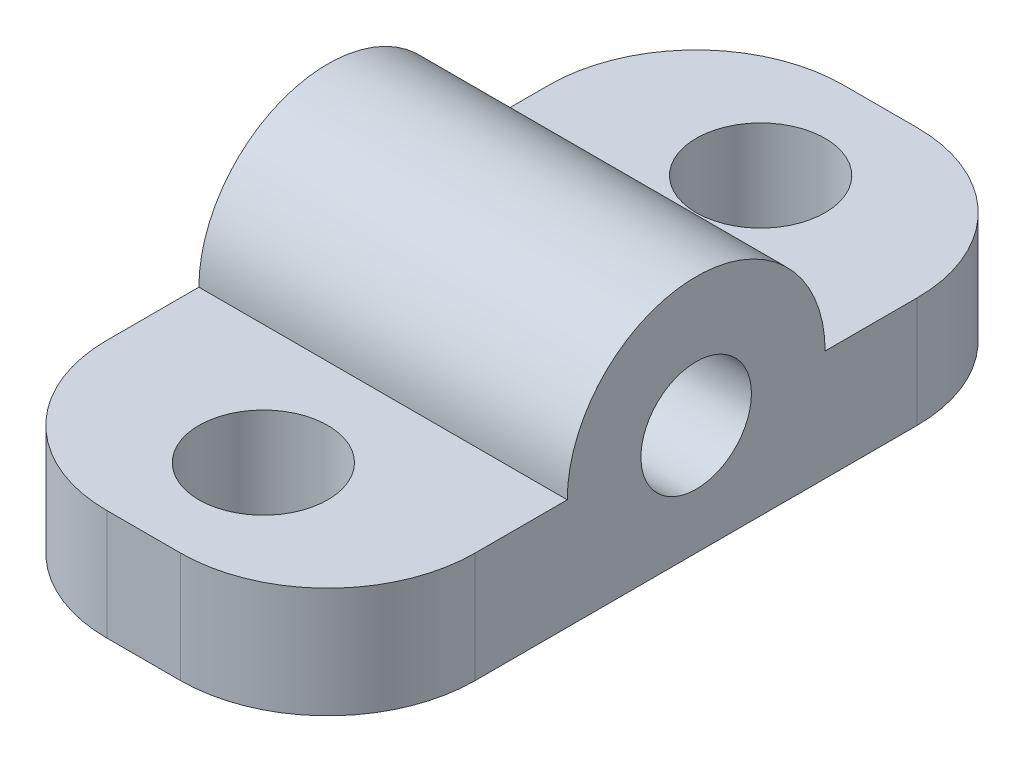
ISO-10303-21;
HEADER;
FILE_DESCRIPTION(('STEP AP214'),'2;1');
FILE_NAME('part.step','',(''),(''),'','','');
FILE_SCHEMA(('AUTOMOTIVE_DESIGN { 1 0 10303 214 1 1 1 1 }'));
ENDSEC;
DATA;
#1=APPLICATION_CONTEXT('core data for automotive mechanical design processes');
#2=APPLICATION_PROTOCOL_DEFINITION('international standard','automotive_design',2000,#1);
#3=PRODUCT_CONTEXT('',#1,'mechanical');
#4=PRODUCT('Part','Part','',(#3));
#5=PRODUCT_RELATED_PRODUCT_CATEGORY('part','',(#4));
#6=PRODUCT_DEFINITION_FORMATION('','',#4);
#7=PRODUCT_DEFINITION_CONTEXT('part definition',#1,'design');
#8=PRODUCT_DEFINITION('design','',#6,#7);
#9=PRODUCT_DEFINITION_SHAPE('','',#8);
#10=(LENGTH_UNIT() NAMED_UNIT(*) SI_UNIT(.MILLI.,.METRE.));
#11=(NAMED_UNIT(*) PLANE_ANGLE_UNIT() SI_UNIT($,.RADIAN.));
#12=(NAMED_UNIT(*) SI_UNIT($,.STERADIAN.) SOLID_ANGLE_UNIT());
#13=UNCERTAINTY_MEASURE_WITH_UNIT(LENGTH_MEASURE(1.E-05),#10,'distance_accuracy_value','');
#14=(GEOMETRIC_REPRESENTATION_CONTEXT(3) GLOBAL_UNCERTAINTY_ASSIGNED_CONTEXT((#13)) GLOBAL_UNIT_ASSIGNED_CONTEXT((#10,
#11,#12)) REPRESENTATION_CONTEXT('',''));
#15=CARTESIAN_POINT('',(0.,0.,0.));
#16=DIRECTION('',(0.,0.,1.));
#17=DIRECTION('',(1.,0.,0.));
#18=AXIS2_PLACEMENT_3D('',#15,#16,#17);
#19=CARTESIAN_POINT('',(10.,0.,0.));
#20=DIRECTION('',(1.,0.,0.));
#21=DIRECTION('',(0.,0.,-1.));
#22=AXIS2_PLACEMENT_3D('',#19,#20,#21);
#23=PLANE('',#22);
#24=DIRECTION('',(0.,0.,1.));
#25=VECTOR('',#24,1.);
#26=CARTESIAN_POINT('',(10.,0.,10.));
#27=LINE('',#26,#25);
#28=CARTESIAN_POINT('',(10.,0.,3.5));
#29=VERTEX_POINT('',#28);
#30=CARTESIAN_POINT('',(10.,0.,6.));
#31=VERTEX_POINT('',#30);
#32=EDGE_CURVE('E135',#29,#31,#27,.T.);
#33=ORIENTED_EDGE('',*,*,#32,.T.);
#34=DIRECTION('',(0.,-1.,0.));
#35=VECTOR('',#34,1.);
#36=CARTESIAN_POINT('',(10.,-3.,6.));
#37=LINE('',#36,#35);
#38=CARTESIAN_POINT('',(10.,-3.,6.));
#39=VERTEX_POINT('',#38);
#40=EDGE_CURVE('E183',#31,#39,#37,.T.);
#41=ORIENTED_EDGE('',*,*,#40,.T.);
#42=DIRECTION('',(0.,0.,-1.));
#43=VECTOR('',#42,1.);
#44=CARTESIAN_POINT('',(10.,-3.,10.));
#45=LINE('',#44,#43);
#46=CARTESIAN_POINT('',(10.,-3.,-6.));
#47=VERTEX_POINT('',#46);
#48=EDGE_CURVE('E120',#39,#47,#45,.T.);
#49=ORIENTED_EDGE('',*,*,#48,.T.);
#50=DIRECTION('',(0.,1.,0.));
#51=VECTOR('',#50,1.);
#52=CARTESIAN_POINT('',(10.,0.,-6.));
#53=LINE('',#52,#51);
#54=CARTESIAN_POINT('',(10.,0.,-6.));
#55=VERTEX_POINT('',#54);
#56=EDGE_CURVE('E119',#47,#55,#53,.T.);
#57=ORIENTED_EDGE('',*,*,#56,.T.);
#58=DIRECTION('',(0.,0.,1.));
#59=VECTOR('',#58,1.);
#60=CARTESIAN_POINT('',(10.,0.,-3.5));
#61=LINE('',#60,#59);
#62=CARTESIAN_POINT('',(10.,0.,-3.5));
#63=VERTEX_POINT('',#62);
#64=EDGE_CURVE('E110',#55,#63,#61,.T.);
#65=ORIENTED_EDGE('',*,*,#64,.T.);
#66=CARTESIAN_POINT('',(10.,0.,0.));
#67=DIRECTION('',(1.,0.,0.));
#68=DIRECTION('',(0.,0.,-1.));
#69=AXIS2_PLACEMENT_3D('',#66,#67,#68);
#70=CIRCLE('',#69,3.5);
#71=EDGE_CURVE('E115',#63,#29,#70,.T.);
#72=ORIENTED_EDGE('',*,*,#71,.T.);
#73=EDGE_LOOP('',(#33,#41,#49,#57,#65,#72));
#74=FACE_BOUND('',#73,.T.);
#75=CARTESIAN_POINT('',(10.,0.,0.));
#76=DIRECTION('',(1.,0.,0.));
#77=DIRECTION('',(0.,0.,-1.));
#78=AXIS2_PLACEMENT_3D('',#75,#76,#77);
#79=CIRCLE('',#78,1.5);
#80=CARTESIAN_POINT('',(10.,0.,-1.5));
#81=VERTEX_POINT('',#80);
#82=EDGE_CURVE('E144',#81,#81,#79,.T.);
#83=ORIENTED_EDGE('',*,*,#82,.F.);
#84=EDGE_LOOP('',(#83));
#85=FACE_BOUND('',#84,.T.);
#86=ADVANCED_FACE('F35',(#74,#85),#23,.T.);
#87=CARTESIAN_POINT('',(0.,0.,0.));
#88=DIRECTION('',(1.,0.,0.));
#89=DIRECTION('',(0.,0.,-1.));
#90=AXIS2_PLACEMENT_3D('',#87,#88,#89);
#91=PLANE('',#90);
#92=DIRECTION('',(0.,0.,-1.));
#93=VECTOR('',#92,1.);
#94=CARTESIAN_POINT('',(0.,-3.,10.));
#95=LINE('',#94,#93);
#96=CARTESIAN_POINT('',(0.,-3.,6.));
#97=VERTEX_POINT('',#96);
#98=CARTESIAN_POINT('',(0.,-3.,-6.));
#99=VERTEX_POINT('',#98);
#100=EDGE_CURVE('E141',#97,#99,#95,.T.);
#101=ORIENTED_EDGE('',*,*,#100,.F.);
#102=DIRECTION('',(0.,-1.,0.));
#103=VECTOR('',#102,1.);
#104=CARTESIAN_POINT('',(0.,0.,6.));
#105=LINE('',#104,#103);
#106=CARTESIAN_POINT('',(0.,0.,6.));
#107=VERTEX_POINT('',#106);
#108=EDGE_CURVE('E176',#97,#107,#105,.F.);
#109=ORIENTED_EDGE('',*,*,#108,.T.);
#110=DIRECTION('',(0.,0.,1.));
#111=VECTOR('',#110,1.);
#112=CARTESIAN_POINT('',(0.,0.,10.));
#113=LINE('',#112,#111);
#114=CARTESIAN_POINT('',(0.,0.,3.5));
#115=VERTEX_POINT('',#114);
#116=EDGE_CURVE('E148',#115,#107,#113,.T.);
#117=ORIENTED_EDGE('',*,*,#116,.F.);
#118=CARTESIAN_POINT('',(0.,0.,0.));
#119=DIRECTION('',(1.,0.,0.));
#120=DIRECTION('',(0.,0.,-1.));
#121=AXIS2_PLACEMENT_3D('',#118,#119,#120);
#122=CIRCLE('',#121,3.5);
#123=CARTESIAN_POINT('',(0.,0.,-3.5));
#124=VERTEX_POINT('',#123);
#125=EDGE_CURVE('E146',#124,#115,#122,.T.);
#126=ORIENTED_EDGE('',*,*,#125,.F.);
#127=DIRECTION('',(0.,0.,1.));
#128=VECTOR('',#127,1.);
#129=CARTESIAN_POINT('',(0.,0.,-3.5));
#130=LINE('',#129,#128);
#131=CARTESIAN_POINT('',(0.,0.,-6.));
#132=VERTEX_POINT('',#131);
#133=EDGE_CURVE('E126',#132,#124,#130,.T.);
#134=ORIENTED_EDGE('',*,*,#133,.F.);
#135=DIRECTION('',(0.,1.,0.));
#136=VECTOR('',#135,1.);
#137=CARTESIAN_POINT('',(0.,0.,-6.));
#138=LINE('',#137,#136);
#139=EDGE_CURVE('E174',#132,#99,#138,.F.);
#140=ORIENTED_EDGE('',*,*,#139,.T.);
#141=EDGE_LOOP('',(#101,#109,#117,#126,#134,#140));
#142=FACE_BOUND('',#141,.T.);
#143=CARTESIAN_POINT('',(0.,0.,0.));
#144=DIRECTION('',(1.,0.,0.));
#145=DIRECTION('',(0.,0.,-1.));
#146=AXIS2_PLACEMENT_3D('',#143,#144,#145);
#147=CIRCLE('',#146,1.5);
#148=CARTESIAN_POINT('',(0.,0.,-1.5));
#149=VERTEX_POINT('',#148);
#150=EDGE_CURVE('E221',#149,#149,#147,.T.);
#151=ORIENTED_EDGE('',*,*,#150,.T.);
#152=EDGE_LOOP('',(#151));
#153=FACE_BOUND('',#152,.T.);
#154=ADVANCED_FACE('F196',(#142,#153),#91,.F.);
#155=CARTESIAN_POINT('',(10.,-3.,10.));
#156=DIRECTION('',(0.,0.,-1.));
#157=DIRECTION('',(-1.,0.,0.));
#158=AXIS2_PLACEMENT_3D('',#155,#156,#157);
#159=PLANE('',#158);
#160=DIRECTION('',(-1.,0.,0.));
#161=VECTOR('',#160,1.);
#162=CARTESIAN_POINT('',(10.,0.,10.));
#163=LINE('',#162,#161);
#164=CARTESIAN_POINT('',(6.,0.,10.));
#165=VERTEX_POINT('',#164);
#166=CARTESIAN_POINT('',(4.,0.,10.));
#167=VERTEX_POINT('',#166);
#168=EDGE_CURVE('E137',#165,#167,#163,.T.);
#169=ORIENTED_EDGE('',*,*,#168,.T.);
#170=DIRECTION('',(0.,-1.,0.));
#171=VECTOR('',#170,1.);
#172=CARTESIAN_POINT('',(4.,-3.,10.));
#173=LINE('',#172,#171);
#174=CARTESIAN_POINT('',(4.,-3.,10.));
#175=VERTEX_POINT('',#174);
#176=EDGE_CURVE('E163',#167,#175,#173,.T.);
#177=ORIENTED_EDGE('',*,*,#176,.T.);
#178=DIRECTION('',(-1.,0.,0.));
#179=VECTOR('',#178,1.);
#180=CARTESIAN_POINT('',(10.,-3.,10.));
#181=LINE('',#180,#179);
#182=CARTESIAN_POINT('',(6.,-3.,10.));
#183=VERTEX_POINT('',#182);
#184=EDGE_CURVE('E158',#183,#175,#181,.T.);
#185=ORIENTED_EDGE('',*,*,#184,.F.);
#186=DIRECTION('',(0.,-1.,0.));
#187=VECTOR('',#186,1.);
#188=CARTESIAN_POINT('',(6.,0.,10.));
#189=LINE('',#188,#187);
#190=EDGE_CURVE('E161',#183,#165,#189,.F.);
#191=ORIENTED_EDGE('',*,*,#190,.T.);
#192=EDGE_LOOP('',(#169,#177,#185,#191));
#193=FACE_BOUND('',#192,.T.);
#194=ADVANCED_FACE('F213',(#193),#159,.F.);
#195=CARTESIAN_POINT('',(10.,-3.,10.));
#196=DIRECTION('',(0.,1.,0.));
#197=DIRECTION('',(0.,0.,1.));
#198=AXIS2_PLACEMENT_3D('',#195,#196,#197);
#199=PLANE('',#198);
#200=CARTESIAN_POINT('',(5.,-3.00000000000001,6.75));
#201=DIRECTION('',(0.,1.,0.));
#202=DIRECTION('',(0.,0.,1.));
#203=AXIS2_PLACEMENT_3D('',#200,#201,#202);
#204=CIRCLE('',#203,1.75);
#205=CARTESIAN_POINT('',(5.,-3.00000000000001,8.5));
#206=VERTEX_POINT('',#205);
#207=EDGE_CURVE('E230',#206,#206,#204,.T.);
#208=ORIENTED_EDGE('',*,*,#207,.T.);
#209=EDGE_LOOP('',(#208));
#210=FACE_BOUND('',#209,.T.);
#211=CARTESIAN_POINT('',(5.,-3.,-6.75));
#212=DIRECTION('',(0.,1.,0.));
#213=DIRECTION('',(0.,0.,1.));
#214=AXIS2_PLACEMENT_3D('',#211,#212,#213);
#215=CIRCLE('',#214,1.75);
#216=CARTESIAN_POINT('',(5.,-3.,-5.));
#217=VERTEX_POINT('',#216);
#218=EDGE_CURVE('E224',#217,#217,#215,.T.);
#219=ORIENTED_EDGE('',*,*,#218,.T.);
#220=EDGE_LOOP('',(#219));
#221=FACE_BOUND('',#220,.T.);
#222=ORIENTED_EDGE('',*,*,#184,.T.);
#223=CARTESIAN_POINT('',(4.,-3.,6.));
#224=DIRECTION('',(0.,1.,0.));
#225=DIRECTION('',(0.,0.,1.));
#226=AXIS2_PLACEMENT_3D('',#223,#224,#225);
#227=CIRCLE('',#226,4.);
#228=EDGE_CURVE('E172',#175,#97,#227,.F.);
#229=ORIENTED_EDGE('',*,*,#228,.T.);
#230=ORIENTED_EDGE('',*,*,#100,.T.);
#231=CARTESIAN_POINT('',(4.,-3.,-6.));
#232=DIRECTION('',(0.,1.,0.));
#233=DIRECTION('',(0.,0.,1.));
#234=AXIS2_PLACEMENT_3D('',#231,#232,#233);
#235=CIRCLE('',#234,4.);
#236=CARTESIAN_POINT('',(4.,-3.,-10.));
#237=VERTEX_POINT('',#236);
#238=EDGE_CURVE('E168',#99,#237,#235,.F.);
#239=ORIENTED_EDGE('',*,*,#238,.T.);
#240=DIRECTION('',(-1.,0.,0.));
#241=VECTOR('',#240,1.);
#242=CARTESIAN_POINT('',(10.,-3.,-10.));
#243=LINE('',#242,#241);
#244=CARTESIAN_POINT('',(6.,-3.,-10.));
#245=VERTEX_POINT('',#244);
#246=EDGE_CURVE('E155',#245,#237,#243,.T.);
#247=ORIENTED_EDGE('',*,*,#246,.F.);
#248=CARTESIAN_POINT('',(6.,-3.,-6.));
#249=DIRECTION('',(0.,1.,0.));
#250=DIRECTION('',(0.,0.,1.));
#251=AXIS2_PLACEMENT_3D('',#248,#249,#250);
#252=CIRCLE('',#251,4.);
#253=EDGE_CURVE('E166',#245,#47,#252,.F.);
#254=ORIENTED_EDGE('',*,*,#253,.T.);
#255=ORIENTED_EDGE('',*,*,#48,.F.);
#256=CARTESIAN_POINT('',(6.,-3.,6.));
#257=DIRECTION('',(0.,1.,0.));
#258=DIRECTION('',(0.,0.,1.));
#259=AXIS2_PLACEMENT_3D('',#256,#257,#258);
#260=CIRCLE('',#259,4.);
#261=EDGE_CURVE('E170',#39,#183,#260,.F.);
#262=ORIENTED_EDGE('',*,*,#261,.T.);
#263=EDGE_LOOP('',(#222,#229,#230,#239,#247,#254,#255,#262));
#264=FACE_BOUND('',#263,.T.);
#265=ADVANCED_FACE('F201',(#210,#221,#264),#199,.F.);
#266=CARTESIAN_POINT('',(10.,0.,-10.));
#267=DIRECTION('',(0.,0.,1.));
#268=DIRECTION('',(1.,0.,0.));
#269=AXIS2_PLACEMENT_3D('',#266,#267,#268);
#270=PLANE('',#269);
#271=ORIENTED_EDGE('',*,*,#246,.T.);
#272=DIRECTION('',(0.,1.,0.));
#273=VECTOR('',#272,1.);
#274=CARTESIAN_POINT('',(4.,0.,-10.));
#275=LINE('',#274,#273);
#276=CARTESIAN_POINT('',(4.,0.,-10.));
#277=VERTEX_POINT('',#276);
#278=EDGE_CURVE('E188',#237,#277,#275,.T.);
#279=ORIENTED_EDGE('',*,*,#278,.T.);
#280=DIRECTION('',(-1.,0.,0.));
#281=VECTOR('',#280,1.);
#282=CARTESIAN_POINT('',(10.,0.,-10.));
#283=LINE('',#282,#281);
#284=CARTESIAN_POINT('',(6.,0.,-10.));
#285=VERTEX_POINT('',#284);
#286=EDGE_CURVE('E129',#285,#277,#283,.T.);
#287=ORIENTED_EDGE('',*,*,#286,.F.);
#288=DIRECTION('',(0.,1.,0.));
#289=VECTOR('',#288,1.);
#290=CARTESIAN_POINT('',(6.,-3.,-10.));
#291=LINE('',#290,#289);
#292=EDGE_CURVE('E186',#285,#245,#291,.F.);
#293=ORIENTED_EDGE('',*,*,#292,.T.);
#294=EDGE_LOOP('',(#271,#279,#287,#293));
#295=FACE_BOUND('',#294,.T.);
#296=ADVANCED_FACE('F190',(#295),#270,.F.);
#297=CARTESIAN_POINT('',(10.,0.,-3.5));
#298=DIRECTION('',(0.,-1.,0.));
#299=DIRECTION('',(0.,0.,-1.));
#300=AXIS2_PLACEMENT_3D('',#297,#298,#299);
#301=PLANE('',#300);
#302=CARTESIAN_POINT('',(5.,0.,-6.75));
#303=DIRECTION('',(0.,1.,0.));
#304=DIRECTION('',(0.,0.,1.));
#305=AXIS2_PLACEMENT_3D('',#302,#303,#304);
#306=CIRCLE('',#305,1.75);
#307=CARTESIAN_POINT('',(5.,0.,-5.));
#308=VERTEX_POINT('',#307);
#309=EDGE_CURVE('E227',#308,#308,#306,.T.);
#310=ORIENTED_EDGE('',*,*,#309,.F.);
#311=EDGE_LOOP('',(#310));
#312=FACE_BOUND('',#311,.T.);
#313=ORIENTED_EDGE('',*,*,#286,.T.);
#314=CARTESIAN_POINT('',(4.,0.,-6.));
#315=DIRECTION('',(0.,-1.,0.));
#316=DIRECTION('',(0.,0.,-1.));
#317=AXIS2_PLACEMENT_3D('',#314,#315,#316);
#318=CIRCLE('',#317,4.);
#319=EDGE_CURVE('E11',#277,#132,#318,.F.);
#320=ORIENTED_EDGE('',*,*,#319,.T.);
#321=ORIENTED_EDGE('',*,*,#133,.T.);
#322=DIRECTION('',(-1.,0.,0.));
#323=VECTOR('',#322,1.);
#324=CARTESIAN_POINT('',(10.,0.,-3.5));
#325=LINE('',#324,#323);
#326=EDGE_CURVE('E123',#63,#124,#325,.T.);
#327=ORIENTED_EDGE('',*,*,#326,.F.);
#328=ORIENTED_EDGE('',*,*,#64,.F.);
#329=CARTESIAN_POINT('',(6.,0.,-6.));
#330=DIRECTION('',(0.,-1.,0.));
#331=DIRECTION('',(0.,0.,-1.));
#332=AXIS2_PLACEMENT_3D('',#329,#330,#331);
#333=CIRCLE('',#332,4.);
#334=EDGE_CURVE('E43',#55,#285,#333,.F.);
#335=ORIENTED_EDGE('',*,*,#334,.T.);
#336=EDGE_LOOP('',(#313,#320,#321,#327,#328,#335));
#337=FACE_BOUND('',#336,.T.);
#338=ADVANCED_FACE('F124',(#312,#337),#301,.F.);
#339=CARTESIAN_POINT('',(10.,0.,0.));
#340=DIRECTION('',(-1.,0.,0.));
#341=DIRECTION('',(0.,0.,1.));
#342=AXIS2_PLACEMENT_3D('',#339,#340,#341);
#343=CYLINDRICAL_SURFACE('',#342,3.5);
#344=ORIENTED_EDGE('',*,*,#125,.T.);
#345=DIRECTION('',(-1.,0.,0.));
#346=VECTOR('',#345,1.);
#347=CARTESIAN_POINT('',(10.,0.,3.5));
#348=LINE('',#347,#346);
#349=EDGE_CURVE('E130',#29,#115,#348,.T.);
#350=ORIENTED_EDGE('',*,*,#349,.F.);
#351=ORIENTED_EDGE('',*,*,#71,.F.);
#352=ORIENTED_EDGE('',*,*,#326,.T.);
#353=EDGE_LOOP('',(#344,#350,#351,#352));
#354=FACE_BOUND('',#353,.T.);
#355=ADVANCED_FACE('F132',(#354),#343,.T.);
#356=CARTESIAN_POINT('',(10.,0.,10.));
#357=DIRECTION('',(0.,-1.,0.));
#358=DIRECTION('',(0.,0.,-1.));
#359=AXIS2_PLACEMENT_3D('',#356,#357,#358);
#360=PLANE('',#359);
#361=CARTESIAN_POINT('',(5.,0.,6.75));
#362=DIRECTION('',(0.,1.,0.));
#363=DIRECTION('',(0.,0.,1.));
#364=AXIS2_PLACEMENT_3D('',#361,#362,#363);
#365=CIRCLE('',#364,1.75);
#366=CARTESIAN_POINT('',(5.,0.,8.5));
#367=VERTEX_POINT('',#366);
#368=EDGE_CURVE('E233',#367,#367,#365,.T.);
#369=ORIENTED_EDGE('',*,*,#368,.F.);
#370=EDGE_LOOP('',(#369));
#371=FACE_BOUND('',#370,.T.);
#372=ORIENTED_EDGE('',*,*,#116,.T.);
#373=CARTESIAN_POINT('',(4.,0.,6.));
#374=DIRECTION('',(0.,-1.,0.));
#375=DIRECTION('',(0.,0.,-1.));
#376=AXIS2_PLACEMENT_3D('',#373,#374,#375);
#377=CIRCLE('',#376,4.);
#378=EDGE_CURVE('E180',#107,#167,#377,.F.);
#379=ORIENTED_EDGE('',*,*,#378,.T.);
#380=ORIENTED_EDGE('',*,*,#168,.F.);
#381=CARTESIAN_POINT('',(6.,0.,6.));
#382=DIRECTION('',(0.,-1.,0.));
#383=DIRECTION('',(0.,0.,-1.));
#384=AXIS2_PLACEMENT_3D('',#381,#382,#383);
#385=CIRCLE('',#384,4.);
#386=EDGE_CURVE('E178',#165,#31,#385,.F.);
#387=ORIENTED_EDGE('',*,*,#386,.T.);
#388=ORIENTED_EDGE('',*,*,#32,.F.);
#389=ORIENTED_EDGE('',*,*,#349,.T.);
#390=EDGE_LOOP('',(#372,#379,#380,#387,#388,#389));
#391=FACE_BOUND('',#390,.T.);
#392=ADVANCED_FACE('F210',(#371,#391),#360,.F.);
#393=CARTESIAN_POINT('',(10.,0.,0.));
#394=DIRECTION('',(-1.,0.,0.));
#395=DIRECTION('',(0.,0.,1.));
#396=AXIS2_PLACEMENT_3D('',#393,#394,#395);
#397=CYLINDRICAL_SURFACE('',#396,1.5);
#398=ORIENTED_EDGE('',*,*,#82,.T.);
#399=EDGE_LOOP('',(#398));
#400=FACE_BOUND('',#399,.T.);
#401=ORIENTED_EDGE('',*,*,#150,.F.);
#402=EDGE_LOOP('',(#401));
#403=FACE_BOUND('',#402,.T.);
#404=ADVANCED_FACE('F249',(#400,#403),#397,.F.);
#405=CARTESIAN_POINT('',(5.,-3.,-6.75));
#406=DIRECTION('',(0.,1.,0.));
#407=DIRECTION('',(0.,0.,1.));
#408=AXIS2_PLACEMENT_3D('',#405,#406,#407);
#409=CYLINDRICAL_SURFACE('',#408,1.75);
#410=CARTESIAN_POINT('',(5.,-3.,-5.));
#411=CARTESIAN_POINT('',(5.,-2.96875,-5.));
#412=CARTESIAN_POINT('',(5.,-2.9375,-5.));
#413=CARTESIAN_POINT('',(5.,-2.875,-5.));
#414=CARTESIAN_POINT('',(5.,-2.84375,-5.));
#415=CARTESIAN_POINT('',(5.,-2.78125,-5.));
#416=CARTESIAN_POINT('',(5.,-2.75,-5.));
#417=CARTESIAN_POINT('',(5.,-2.6875,-5.));
#418=CARTESIAN_POINT('',(5.,-2.65625,-5.));
#419=CARTESIAN_POINT('',(5.,-2.59375,-5.));
#420=CARTESIAN_POINT('',(5.,-2.5625,-5.));
#421=CARTESIAN_POINT('',(5.,-2.5,-5.));
#422=CARTESIAN_POINT('',(5.,-2.46875,-5.));
#423=CARTESIAN_POINT('',(5.,-2.40625,-5.));
#424=CARTESIAN_POINT('',(5.,-2.375,-5.));
#425=CARTESIAN_POINT('',(5.,-2.3125,-5.));
#426=CARTESIAN_POINT('',(5.,-2.28125,-5.));
#427=CARTESIAN_POINT('',(5.,-2.21875,-5.));
#428=CARTESIAN_POINT('',(5.,-2.1875,-5.));
#429=CARTESIAN_POINT('',(5.,-2.125,-5.));
#430=CARTESIAN_POINT('',(5.,-2.09375,-5.));
#431=CARTESIAN_POINT('',(5.,-2.03125,-5.));
#432=CARTESIAN_POINT('',(5.,-2.,-5.));
#433=CARTESIAN_POINT('',(5.,-1.9375,-5.));
#434=CARTESIAN_POINT('',(5.,-1.90625,-5.));
#435=CARTESIAN_POINT('',(5.,-1.84375,-5.));
#436=CARTESIAN_POINT('',(5.,-1.8125,-5.));
#437=CARTESIAN_POINT('',(5.,-1.75,-5.));
#438=CARTESIAN_POINT('',(5.,-1.71875,-5.));
#439=CARTESIAN_POINT('',(5.,-1.65625,-5.));
#440=CARTESIAN_POINT('',(5.,-1.625,-5.));
#441=CARTESIAN_POINT('',(5.,-1.5625,-5.));
#442=CARTESIAN_POINT('',(5.,-1.53125,-5.));
#443=CARTESIAN_POINT('',(5.,-1.46875,-5.));
#444=CARTESIAN_POINT('',(5.,-1.4375,-5.));
#445=CARTESIAN_POINT('',(5.,-1.375,-5.));
#446=CARTESIAN_POINT('',(5.,-1.34375,-5.));
#447=CARTESIAN_POINT('',(5.,-1.28125,-5.));
#448=CARTESIAN_POINT('',(5.,-1.25,-5.));
#449=CARTESIAN_POINT('',(5.,-1.1875,-5.));
#450=CARTESIAN_POINT('',(5.,-1.15625,-5.));
#451=CARTESIAN_POINT('',(5.,-1.09375,-5.));
#452=CARTESIAN_POINT('',(5.,-1.0625,-5.));
#453=CARTESIAN_POINT('',(5.,-1.,-5.));
#454=CARTESIAN_POINT('',(5.,-0.96875,-5.));
#455=CARTESIAN_POINT('',(5.,-0.90625,-5.));
#456=CARTESIAN_POINT('',(5.,-0.875,-5.));
#457=CARTESIAN_POINT('',(5.,-0.8125,-5.));
#458=CARTESIAN_POINT('',(5.,-0.78125,-5.));
#459=CARTESIAN_POINT('',(5.,-0.71875,-5.));
#460=CARTESIAN_POINT('',(5.,-0.6875,-5.));
#461=CARTESIAN_POINT('',(5.,-0.625,-5.));
#462=CARTESIAN_POINT('',(5.,-0.59375,-5.));
#463=CARTESIAN_POINT('',(5.,-0.531249999999999,-5.));
#464=CARTESIAN_POINT('',(5.,-0.499999999999999,-5.));
#465=CARTESIAN_POINT('',(5.,-0.437499999999999,-5.));
#466=CARTESIAN_POINT('',(5.,-0.406249999999999,-5.));
#467=CARTESIAN_POINT('',(5.,-0.343749999999999,-5.));
#468=CARTESIAN_POINT('',(5.,-0.312499999999999,-5.));
#469=CARTESIAN_POINT('',(5.,-0.249999999999999,-5.));
#470=CARTESIAN_POINT('',(5.,-0.218749999999999,-5.));
#471=CARTESIAN_POINT('',(5.,-0.156249999999999,-5.));
#472=CARTESIAN_POINT('',(5.,-0.124999999999999,-5.));
#473=CARTESIAN_POINT('',(5.,-0.0624999999999988,-5.));
#474=CARTESIAN_POINT('',(5.,-0.0312499999999987,-5.));
#475=CARTESIAN_POINT('',(5.,0.,-5.));
#476=B_SPLINE_CURVE_WITH_KNOTS('',3,(#410,#411,#412,#413,#414,#415,#416,#417,#418,#419,#420,
#421,#422,#423,#424,#425,#426,#427,#428,#429,#430,#431,#432,#433,#434,#435,#436,#437,#438,#439,
#440,#441,#442,#443,#444,#445,#446,#447,#448,#449,#450,#451,#452,#453,#454,#455,#456,#457,#458,
#459,#460,#461,#462,#463,#464,#465,#466,#467,#468,#469,#470,#471,#472,#473,#474,#475),
.UNSPECIFIED.,.F.,.F.,(4,2,2,2,2,2,2,2,2,2,2,2,2,2,2,2,2,2,2,2,2,2,2,2,2,2,2,2,2,2,2,2,4),(0.,
0.0937500000000005,0.187500000000001,0.281250000000001,0.375000000000001,0.468750000000001,
0.562500000000001,0.656250000000001,0.750000000000001,0.843750000000001,0.937500000000001,
1.03125,1.125,1.21875,1.3125,1.40625,1.5,1.59375,1.6875,1.78125,1.875,1.96875,2.0625,2.15625,
2.25,2.34375,2.4375,2.53125,2.625,2.71875,2.8125,2.90625,3.),.UNSPECIFIED.);
#477=EDGE_CURVE('BSEAM244',#217,#308,#476,.T.);
#478=ORIENTED_EDGE('',*,*,#218,.F.);
#479=ORIENTED_EDGE('',*,*,#309,.T.);
#480=ORIENTED_EDGE('',*,*,#477,.T.);
#481=ORIENTED_EDGE('',*,*,#477,.F.);
#482=EDGE_LOOP('',(#478,#480,#479,#481));
#483=FACE_BOUND('',#482,.T.);
#484=ADVANCED_FACE('F244',(#483),#409,.F.);
#485=CARTESIAN_POINT('',(5.,-3.00000000000001,6.75));
#486=DIRECTION('',(0.,1.,0.));
#487=DIRECTION('',(0.,0.,1.));
#488=AXIS2_PLACEMENT_3D('',#485,#486,#487);
#489=CYLINDRICAL_SURFACE('',#488,1.75);
#490=CARTESIAN_POINT('',(5.,-3.00000000000001,8.5));
#491=CARTESIAN_POINT('',(5.,-2.96875000000001,8.5));
#492=CARTESIAN_POINT('',(5.,-2.93750000000001,8.5));
#493=CARTESIAN_POINT('',(5.,-2.87500000000001,8.5));
#494=CARTESIAN_POINT('',(5.,-2.84375000000001,8.5));
#495=CARTESIAN_POINT('',(5.,-2.78125000000001,8.5));
#496=CARTESIAN_POINT('',(5.,-2.75000000000001,8.5));
#497=CARTESIAN_POINT('',(5.,-2.68750000000001,8.5));
#498=CARTESIAN_POINT('',(5.,-2.65625000000001,8.5));
#499=CARTESIAN_POINT('',(5.,-2.59375000000001,8.5));
#500=CARTESIAN_POINT('',(5.,-2.56250000000001,8.5));
#501=CARTESIAN_POINT('',(5.,-2.50000000000001,8.5));
#502=CARTESIAN_POINT('',(5.,-2.46875000000001,8.5));
#503=CARTESIAN_POINT('',(5.,-2.40625000000001,8.5));
#504=CARTESIAN_POINT('',(5.,-2.37500000000001,8.5));
#505=CARTESIAN_POINT('',(5.,-2.31250000000001,8.5));
#506=CARTESIAN_POINT('',(5.,-2.28125000000001,8.5));
#507=CARTESIAN_POINT('',(5.,-2.21875000000001,8.5));
#508=CARTESIAN_POINT('',(5.,-2.18750000000001,8.5));
#509=CARTESIAN_POINT('',(5.,-2.12500000000001,8.5));
#510=CARTESIAN_POINT('',(5.,-2.09375000000001,8.5));
#511=CARTESIAN_POINT('',(5.,-2.03125000000001,8.5));
#512=CARTESIAN_POINT('',(5.,-2.00000000000001,8.5));
#513=CARTESIAN_POINT('',(5.,-1.93750000000001,8.5));
#514=CARTESIAN_POINT('',(5.,-1.90625000000001,8.5));
#515=CARTESIAN_POINT('',(5.,-1.84375000000001,8.5));
#516=CARTESIAN_POINT('',(5.,-1.81250000000001,8.5));
#517=CARTESIAN_POINT('',(5.,-1.75000000000001,8.5));
#518=CARTESIAN_POINT('',(5.,-1.71875,8.5));
#519=CARTESIAN_POINT('',(5.,-1.65625,8.5));
#520=CARTESIAN_POINT('',(5.,-1.625,8.5));
#521=CARTESIAN_POINT('',(5.,-1.5625,8.5));
#522=CARTESIAN_POINT('',(5.,-1.53125,8.5));
#523=CARTESIAN_POINT('',(5.,-1.46875,8.5));
#524=CARTESIAN_POINT('',(5.,-1.4375,8.5));
#525=CARTESIAN_POINT('',(5.,-1.375,8.5));
#526=CARTESIAN_POINT('',(5.,-1.34375,8.5));
#527=CARTESIAN_POINT('',(5.,-1.28125,8.5));
#528=CARTESIAN_POINT('',(5.,-1.25,8.5));
#529=CARTESIAN_POINT('',(5.,-1.1875,8.5));
#530=CARTESIAN_POINT('',(5.,-1.15625,8.5));
#531=CARTESIAN_POINT('',(5.,-1.09375,8.5));
#532=CARTESIAN_POINT('',(5.,-1.0625,8.5));
#533=CARTESIAN_POINT('',(5.,-1.,8.5));
#534=CARTESIAN_POINT('',(5.,-0.968750000000004,8.5));
#535=CARTESIAN_POINT('',(5.,-0.906250000000004,8.5));
#536=CARTESIAN_POINT('',(5.,-0.875000000000004,8.5));
#537=CARTESIAN_POINT('',(5.,-0.812500000000004,8.5));
#538=CARTESIAN_POINT('',(5.,-0.781250000000004,8.5));
#539=CARTESIAN_POINT('',(5.,-0.718750000000004,8.5));
#540=CARTESIAN_POINT('',(5.,-0.687500000000004,8.5));
#541=CARTESIAN_POINT('',(5.,-0.625000000000004,8.5));
#542=CARTESIAN_POINT('',(5.,-0.593750000000004,8.5));
#543=CARTESIAN_POINT('',(5.,-0.531250000000004,8.5));
#544=CARTESIAN_POINT('',(5.,-0.500000000000004,8.5));
#545=CARTESIAN_POINT('',(5.,-0.437500000000003,8.5));
#546=CARTESIAN_POINT('',(5.,-0.406250000000003,8.5));
#547=CARTESIAN_POINT('',(5.,-0.343750000000003,8.5));
#548=CARTESIAN_POINT('',(5.,-0.312500000000003,8.5));
#549=CARTESIAN_POINT('',(5.,-0.250000000000003,8.5));
#550=CARTESIAN_POINT('',(5.,-0.218750000000003,8.5));
#551=CARTESIAN_POINT('',(5.,-0.156250000000003,8.5));
#552=CARTESIAN_POINT('',(5.,-0.125000000000003,8.5));
#553=CARTESIAN_POINT('',(5.,-0.0625000000000031,8.5));
#554=CARTESIAN_POINT('',(5.,-0.0312500000000031,8.5));
#555=CARTESIAN_POINT('',(5.,0.,8.5));
#556=B_SPLINE_CURVE_WITH_KNOTS('',3,(#490,#491,#492,#493,#494,#495,#496,#497,#498,#499,#500,
#501,#502,#503,#504,#505,#506,#507,#508,#509,#510,#511,#512,#513,#514,#515,#516,#517,#518,#519,
#520,#521,#522,#523,#524,#525,#526,#527,#528,#529,#530,#531,#532,#533,#534,#535,#536,#537,#538,
#539,#540,#541,#542,#543,#544,#545,#546,#547,#548,#549,#550,#551,#552,#553,#554,#555),
.UNSPECIFIED.,.F.,.F.,(4,2,2,2,2,2,2,2,2,2,2,2,2,2,2,2,2,2,2,2,2,2,2,2,2,2,2,2,2,2,2,2,4),(0.,
0.0937500000000005,0.187500000000001,0.281250000000001,0.375000000000001,0.468750000000001,
0.562500000000001,0.656250000000001,0.750000000000001,0.843750000000001,0.937500000000001,
1.03125,1.125,1.21875,1.3125,1.40625,1.5,1.59375,1.6875,1.78125,1.875,1.96875,2.0625,2.15625,
2.25,2.34375,2.4375,2.53125,2.625,2.71875,2.8125,2.90625,3.),.UNSPECIFIED.);
#557=EDGE_CURVE('BSEAM241',#206,#367,#556,.T.);
#558=ORIENTED_EDGE('',*,*,#207,.F.);
#559=ORIENTED_EDGE('',*,*,#368,.T.);
#560=ORIENTED_EDGE('',*,*,#557,.T.);
#561=ORIENTED_EDGE('',*,*,#557,.F.);
#562=EDGE_LOOP('',(#558,#560,#559,#561));
#563=FACE_BOUND('',#562,.T.);
#564=ADVANCED_FACE('F241',(#563),#489,.F.);
#565=CARTESIAN_POINT('',(4.,-3.,6.));
#566=DIRECTION('',(0.,-1.,0.));
#567=DIRECTION('',(0.,0.,-1.));
#568=AXIS2_PLACEMENT_3D('',#565,#566,#567);
#569=CYLINDRICAL_SURFACE('',#568,4.);
#570=ORIENTED_EDGE('',*,*,#378,.F.);
#571=ORIENTED_EDGE('',*,*,#108,.F.);
#572=ORIENTED_EDGE('',*,*,#228,.F.);
#573=ORIENTED_EDGE('',*,*,#176,.F.);
#574=EDGE_LOOP('',(#570,#571,#572,#573));
#575=FACE_BOUND('',#574,.T.);
#576=ADVANCED_FACE('F206',(#575),#569,.T.);
#577=CARTESIAN_POINT('',(6.,0.,6.));
#578=DIRECTION('',(0.,1.,0.));
#579=DIRECTION('',(0.,0.,1.));
#580=AXIS2_PLACEMENT_3D('',#577,#578,#579);
#581=CYLINDRICAL_SURFACE('',#580,4.);
#582=ORIENTED_EDGE('',*,*,#386,.F.);
#583=ORIENTED_EDGE('',*,*,#190,.F.);
#584=ORIENTED_EDGE('',*,*,#261,.F.);
#585=ORIENTED_EDGE('',*,*,#40,.F.);
#586=EDGE_LOOP('',(#582,#583,#584,#585));
#587=FACE_BOUND('',#586,.T.);
#588=ADVANCED_FACE('F217',(#587),#581,.T.);
#589=CARTESIAN_POINT('',(4.,0.,-6.));
#590=DIRECTION('',(0.,1.,0.));
#591=DIRECTION('',(0.,0.,1.));
#592=AXIS2_PLACEMENT_3D('',#589,#590,#591);
#593=CYLINDRICAL_SURFACE('',#592,4.);
#594=ORIENTED_EDGE('',*,*,#238,.F.);
#595=ORIENTED_EDGE('',*,*,#139,.F.);
#596=ORIENTED_EDGE('',*,*,#319,.F.);
#597=ORIENTED_EDGE('',*,*,#278,.F.);
#598=EDGE_LOOP('',(#594,#595,#596,#597));
#599=FACE_BOUND('',#598,.T.);
#600=ADVANCED_FACE('F199',(#599),#593,.T.);
#601=CARTESIAN_POINT('',(6.,0.,-6.));
#602=DIRECTION('',(0.,-1.,0.));
#603=DIRECTION('',(0.,0.,-1.));
#604=AXIS2_PLACEMENT_3D('',#601,#602,#603);
#605=CYLINDRICAL_SURFACE('',#604,4.);
#606=ORIENTED_EDGE('',*,*,#253,.F.);
#607=ORIENTED_EDGE('',*,*,#292,.F.);
#608=ORIENTED_EDGE('',*,*,#334,.F.);
#609=ORIENTED_EDGE('',*,*,#56,.F.);
#610=EDGE_LOOP('',(#606,#607,#608,#609));
#611=FACE_BOUND('',#610,.T.);
#612=ADVANCED_FACE('F37',(#611),#605,.T.);
#613=CLOSED_SHELL('',(#86,#154,#194,#265,#296,#338,#355,#392,#404,#484,#564,#576,#588,#600,#612));
#614=MANIFOLD_SOLID_BREP('B2',#613);
#615=ADVANCED_BREP_SHAPE_REPRESENTATION('',(#18,#614),#14);
#616=SHAPE_DEFINITION_REPRESENTATION(#9,#615);
ENDSEC;
END-ISO-10303-21;
